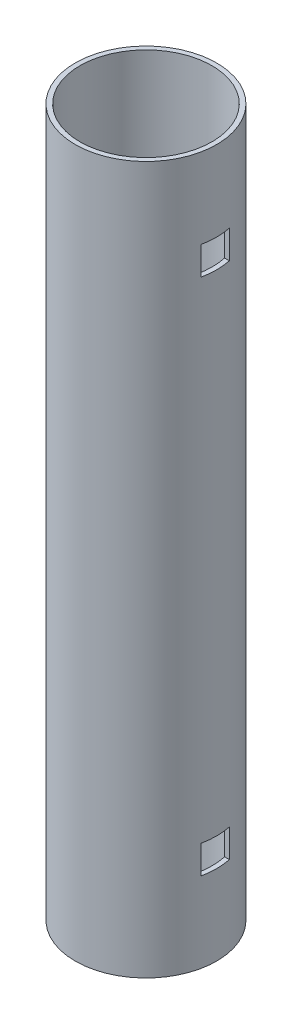
ISO-10303-21;
HEADER;
FILE_DESCRIPTION(('STEP AP214'),'2;1');
FILE_NAME('part.step','',(''),(''),'','','');
FILE_SCHEMA(('AUTOMOTIVE_DESIGN { 1 0 10303 214 1 1 1 1 }'));
ENDSEC;
DATA;
#1=APPLICATION_CONTEXT('core data for automotive mechanical design processes');
#2=APPLICATION_PROTOCOL_DEFINITION('international standard','automotive_design',2000,#1);
#3=PRODUCT_CONTEXT('',#1,'mechanical');
#4=PRODUCT('Part','Part','',(#3));
#5=PRODUCT_RELATED_PRODUCT_CATEGORY('part','',(#4));
#6=PRODUCT_DEFINITION_FORMATION('','',#4);
#7=PRODUCT_DEFINITION_CONTEXT('part definition',#1,'design');
#8=PRODUCT_DEFINITION('design','',#6,#7);
#9=PRODUCT_DEFINITION_SHAPE('','',#8);
#10=(LENGTH_UNIT() NAMED_UNIT(*) SI_UNIT(.MILLI.,.METRE.));
#11=(NAMED_UNIT(*) PLANE_ANGLE_UNIT() SI_UNIT($,.RADIAN.));
#12=(NAMED_UNIT(*) SI_UNIT($,.STERADIAN.) SOLID_ANGLE_UNIT());
#13=UNCERTAINTY_MEASURE_WITH_UNIT(LENGTH_MEASURE(1.E-05),#10,'distance_accuracy_value','');
#14=(GEOMETRIC_REPRESENTATION_CONTEXT(3) GLOBAL_UNCERTAINTY_ASSIGNED_CONTEXT((#13)) GLOBAL_UNIT_ASSIGNED_CONTEXT((#10,
#11,#12)) REPRESENTATION_CONTEXT('',''));
#15=CARTESIAN_POINT('',(0.,0.,0.));
#16=DIRECTION('',(0.,0.,1.));
#17=DIRECTION('',(1.,0.,0.));
#18=AXIS2_PLACEMENT_3D('',#15,#16,#17);
#19=CARTESIAN_POINT('',(0.,150.,0.));
#20=DIRECTION('',(0.,1.,0.));
#21=DIRECTION('',(0.,0.,1.));
#22=AXIS2_PLACEMENT_3D('',#19,#20,#21);
#23=PLANE('',#22);
#24=CARTESIAN_POINT('',(0.,150.,0.));
#25=DIRECTION('',(0.,1.,0.));
#26=DIRECTION('',(0.,0.,1.));
#27=AXIS2_PLACEMENT_3D('',#24,#25,#26);
#28=CIRCLE('',#27,15.);
#29=CARTESIAN_POINT('',(0.,150.,15.));
#30=VERTEX_POINT('',#29);
#31=EDGE_CURVE('E203',#30,#30,#28,.T.);
#32=ORIENTED_EDGE('',*,*,#31,.T.);
#33=EDGE_LOOP('',(#32));
#34=FACE_BOUND('',#33,.T.);
#35=CARTESIAN_POINT('',(0.,150.,0.));
#36=DIRECTION('',(0.,1.,0.));
#37=DIRECTION('',(0.,0.,1.));
#38=AXIS2_PLACEMENT_3D('',#35,#36,#37);
#39=CIRCLE('',#38,14.);
#40=CARTESIAN_POINT('',(0.,150.,14.));
#41=VERTEX_POINT('',#40);
#42=EDGE_CURVE('E197',#41,#41,#39,.T.);
#43=ORIENTED_EDGE('',*,*,#42,.F.);
#44=EDGE_LOOP('',(#43));
#45=FACE_BOUND('',#44,.T.);
#46=ADVANCED_FACE('F35',(#34,#45),#23,.T.);
#47=CARTESIAN_POINT('',(0.,0.,0.));
#48=DIRECTION('',(0.,1.,0.));
#49=DIRECTION('',(0.,0.,1.));
#50=AXIS2_PLACEMENT_3D('',#47,#48,#49);
#51=PLANE('',#50);
#52=CARTESIAN_POINT('',(0.,0.,0.));
#53=DIRECTION('',(0.,1.,0.));
#54=DIRECTION('',(0.,0.,1.));
#55=AXIS2_PLACEMENT_3D('',#52,#53,#54);
#56=CIRCLE('',#55,15.);
#57=CARTESIAN_POINT('',(0.,0.,15.));
#58=VERTEX_POINT('',#57);
#59=EDGE_CURVE('E200',#58,#58,#56,.T.);
#60=ORIENTED_EDGE('',*,*,#59,.F.);
#61=EDGE_LOOP('',(#60));
#62=FACE_BOUND('',#61,.T.);
#63=CARTESIAN_POINT('',(0.,0.,0.));
#64=DIRECTION('',(0.,1.,0.));
#65=DIRECTION('',(0.,0.,1.));
#66=AXIS2_PLACEMENT_3D('',#63,#64,#65);
#67=CIRCLE('',#66,14.);
#68=CARTESIAN_POINT('',(0.,0.,14.));
#69=VERTEX_POINT('',#68);
#70=EDGE_CURVE('E196',#69,#69,#67,.T.);
#71=ORIENTED_EDGE('',*,*,#70,.T.);
#72=EDGE_LOOP('',(#71));
#73=FACE_BOUND('',#72,.T.);
#74=ADVANCED_FACE('F300',(#62,#73),#51,.F.);
#75=CARTESIAN_POINT('',(0.,150.,0.));
#76=DIRECTION('',(0.,-1.,0.));
#77=DIRECTION('',(0.,0.,-1.));
#78=AXIS2_PLACEMENT_3D('',#75,#76,#77);
#79=CYLINDRICAL_SURFACE('',#78,15.);
#80=DIRECTION('',(0.,-1.,0.));
#81=VECTOR('',#80,1.);
#82=CARTESIAN_POINT('',(-14.6969384566991,150.,-3.));
#83=LINE('',#82,#81);
#84=CARTESIAN_POINT('',(-14.6969384566991,17.,-3.));
#85=VERTEX_POINT('',#84);
#86=CARTESIAN_POINT('',(-14.6969384566991,23.,-3.));
#87=VERTEX_POINT('',#86);
#88=EDGE_CURVE('E192',#85,#87,#83,.F.);
#89=ORIENTED_EDGE('',*,*,#88,.T.);
#90=CARTESIAN_POINT('',(0.,23.,0.));
#91=DIRECTION('',(0.,1.,0.));
#92=DIRECTION('',(0.,0.,1.));
#93=AXIS2_PLACEMENT_3D('',#90,#91,#92);
#94=CIRCLE('',#93,15.);
#95=CARTESIAN_POINT('',(-14.6969384566991,23.,3.));
#96=VERTEX_POINT('',#95);
#97=EDGE_CURVE('E50',#87,#96,#94,.T.);
#98=ORIENTED_EDGE('',*,*,#97,.T.);
#99=DIRECTION('',(0.,-1.,0.));
#100=VECTOR('',#99,1.);
#101=CARTESIAN_POINT('',(-14.6969384566991,150.,3.));
#102=LINE('',#101,#100);
#103=CARTESIAN_POINT('',(-14.6969384566991,17.,3.));
#104=VERTEX_POINT('',#103);
#105=EDGE_CURVE('E187',#96,#104,#102,.T.);
#106=ORIENTED_EDGE('',*,*,#105,.T.);
#107=CARTESIAN_POINT('',(0.,17.,0.));
#108=DIRECTION('',(0.,-1.,0.));
#109=DIRECTION('',(0.,0.,-1.));
#110=AXIS2_PLACEMENT_3D('',#107,#108,#109);
#111=CIRCLE('',#110,15.);
#112=EDGE_CURVE('E189',#104,#85,#111,.T.);
#113=ORIENTED_EDGE('',*,*,#112,.T.);
#114=EDGE_LOOP('',(#89,#98,#106,#113));
#115=FACE_BOUND('',#114,.T.);
#116=DIRECTION('',(0.,-1.,0.));
#117=VECTOR('',#116,1.);
#118=CARTESIAN_POINT('',(14.6969384566991,150.,3.));
#119=LINE('',#118,#117);
#120=CARTESIAN_POINT('',(14.6969384566991,17.,3.));
#121=VERTEX_POINT('',#120);
#122=CARTESIAN_POINT('',(14.6969384566991,23.,3.));
#123=VERTEX_POINT('',#122);
#124=EDGE_CURVE('E185',#121,#123,#119,.F.);
#125=ORIENTED_EDGE('',*,*,#124,.T.);
#126=CARTESIAN_POINT('',(14.6969384566991,23.,-3.));
#127=VERTEX_POINT('',#126);
#128=EDGE_CURVE('E58',#123,#127,#94,.T.);
#129=ORIENTED_EDGE('',*,*,#128,.T.);
#130=DIRECTION('',(0.,-1.,0.));
#131=VECTOR('',#130,1.);
#132=CARTESIAN_POINT('',(14.6969384566991,150.,-3.));
#133=LINE('',#132,#131);
#134=CARTESIAN_POINT('',(14.6969384566991,17.,-3.));
#135=VERTEX_POINT('',#134);
#136=EDGE_CURVE('E194',#127,#135,#133,.T.);
#137=ORIENTED_EDGE('',*,*,#136,.T.);
#138=EDGE_CURVE('E190',#135,#121,#111,.T.);
#139=ORIENTED_EDGE('',*,*,#138,.T.);
#140=EDGE_LOOP('',(#125,#129,#137,#139));
#141=FACE_BOUND('',#140,.T.);
#142=DIRECTION('',(0.,-1.,0.));
#143=VECTOR('',#142,1.);
#144=CARTESIAN_POINT('',(-14.6969384566991,150.,-3.));
#145=LINE('',#144,#143);
#146=CARTESIAN_POINT('',(-14.6969384566991,127.,-3.));
#147=VERTEX_POINT('',#146);
#148=CARTESIAN_POINT('',(-14.6969384566991,133.,-3.));
#149=VERTEX_POINT('',#148);
#150=EDGE_CURVE('E166',#147,#149,#145,.F.);
#151=ORIENTED_EDGE('',*,*,#150,.T.);
#152=CARTESIAN_POINT('',(0.,133.,0.));
#153=DIRECTION('',(0.,1.,0.));
#154=DIRECTION('',(0.,0.,1.));
#155=AXIS2_PLACEMENT_3D('',#152,#153,#154);
#156=CIRCLE('',#155,15.);
#157=CARTESIAN_POINT('',(-14.6969384566991,133.,3.));
#158=VERTEX_POINT('',#157);
#159=EDGE_CURVE('E148',#149,#158,#156,.T.);
#160=ORIENTED_EDGE('',*,*,#159,.T.);
#161=DIRECTION('',(0.,-1.,0.));
#162=VECTOR('',#161,1.);
#163=CARTESIAN_POINT('',(-14.6969384566991,150.,3.));
#164=LINE('',#163,#162);
#165=CARTESIAN_POINT('',(-14.6969384566991,127.,3.));
#166=VERTEX_POINT('',#165);
#167=EDGE_CURVE('E283',#158,#166,#164,.T.);
#168=ORIENTED_EDGE('',*,*,#167,.T.);
#169=CARTESIAN_POINT('',(0.,127.,0.));
#170=DIRECTION('',(0.,-1.,0.));
#171=DIRECTION('',(0.,0.,-1.));
#172=AXIS2_PLACEMENT_3D('',#169,#170,#171);
#173=CIRCLE('',#172,15.);
#174=EDGE_CURVE('E175',#166,#147,#173,.T.);
#175=ORIENTED_EDGE('',*,*,#174,.T.);
#176=EDGE_LOOP('',(#151,#160,#168,#175));
#177=FACE_BOUND('',#176,.T.);
#178=DIRECTION('',(0.,-1.,0.));
#179=VECTOR('',#178,1.);
#180=CARTESIAN_POINT('',(14.6969384566991,150.,3.));
#181=LINE('',#180,#179);
#182=CARTESIAN_POINT('',(14.6969384566991,127.,3.));
#183=VERTEX_POINT('',#182);
#184=CARTESIAN_POINT('',(14.6969384566991,133.,3.));
#185=VERTEX_POINT('',#184);
#186=EDGE_CURVE('E281',#183,#185,#181,.F.);
#187=ORIENTED_EDGE('',*,*,#186,.T.);
#188=CARTESIAN_POINT('',(14.6969384566991,133.,-3.));
#189=VERTEX_POINT('',#188);
#190=EDGE_CURVE('E159',#185,#189,#156,.T.);
#191=ORIENTED_EDGE('',*,*,#190,.T.);
#192=DIRECTION('',(0.,-1.,0.));
#193=VECTOR('',#192,1.);
#194=CARTESIAN_POINT('',(14.6969384566991,150.,-3.));
#195=LINE('',#194,#193);
#196=CARTESIAN_POINT('',(14.6969384566991,127.,-3.));
#197=VERTEX_POINT('',#196);
#198=EDGE_CURVE('E176',#189,#197,#195,.T.);
#199=ORIENTED_EDGE('',*,*,#198,.T.);
#200=EDGE_CURVE('E177',#197,#183,#173,.T.);
#201=ORIENTED_EDGE('',*,*,#200,.T.);
#202=EDGE_LOOP('',(#187,#191,#199,#201));
#203=FACE_BOUND('',#202,.T.);
#204=ORIENTED_EDGE('',*,*,#31,.F.);
#205=EDGE_LOOP('',(#204));
#206=FACE_BOUND('',#205,.T.);
#207=ORIENTED_EDGE('',*,*,#59,.T.);
#208=EDGE_LOOP('',(#207));
#209=FACE_BOUND('',#208,.T.);
#210=ADVANCED_FACE('F37',(#115,#141,#177,#203,#206,#209),#79,.T.);
#211=CARTESIAN_POINT('',(0.,150.,0.));
#212=DIRECTION('',(0.,-1.,0.));
#213=DIRECTION('',(0.,0.,-1.));
#214=AXIS2_PLACEMENT_3D('',#211,#212,#213);
#215=CYLINDRICAL_SURFACE('',#214,14.);
#216=DIRECTION('',(0.,-1.,0.));
#217=VECTOR('',#216,1.);
#218=CARTESIAN_POINT('',(13.6747943311773,150.,-3.));
#219=LINE('',#218,#217);
#220=CARTESIAN_POINT('',(13.6747943311773,23.,-3.));
#221=VERTEX_POINT('',#220);
#222=CARTESIAN_POINT('',(13.6747943311773,17.,-3.));
#223=VERTEX_POINT('',#222);
#224=EDGE_CURVE('E11',#221,#223,#219,.T.);
#225=ORIENTED_EDGE('',*,*,#224,.F.);
#226=CARTESIAN_POINT('',(0.,23.,0.));
#227=DIRECTION('',(0.,1.,0.));
#228=DIRECTION('',(0.,0.,1.));
#229=AXIS2_PLACEMENT_3D('',#226,#227,#228);
#230=CIRCLE('',#229,14.);
#231=CARTESIAN_POINT('',(13.6747943311773,23.,3.));
#232=VERTEX_POINT('',#231);
#233=EDGE_CURVE('E225',#232,#221,#230,.T.);
#234=ORIENTED_EDGE('',*,*,#233,.F.);
#235=DIRECTION('',(0.,-1.,0.));
#236=VECTOR('',#235,1.);
#237=CARTESIAN_POINT('',(13.6747943311773,150.,3.));
#238=LINE('',#237,#236);
#239=CARTESIAN_POINT('',(13.6747943311773,17.,3.));
#240=VERTEX_POINT('',#239);
#241=EDGE_CURVE('E231',#240,#232,#238,.F.);
#242=ORIENTED_EDGE('',*,*,#241,.F.);
#243=CARTESIAN_POINT('',(0.,17.,0.));
#244=DIRECTION('',(0.,-1.,0.));
#245=DIRECTION('',(0.,0.,-1.));
#246=AXIS2_PLACEMENT_3D('',#243,#244,#245);
#247=CIRCLE('',#246,14.);
#248=EDGE_CURVE('E43',#223,#240,#247,.T.);
#249=ORIENTED_EDGE('',*,*,#248,.F.);
#250=EDGE_LOOP('',(#225,#234,#242,#249));
#251=FACE_BOUND('',#250,.T.);
#252=DIRECTION('',(0.,-1.,0.));
#253=VECTOR('',#252,1.);
#254=CARTESIAN_POINT('',(-13.6747943311773,150.,-3.));
#255=LINE('',#254,#253);
#256=CARTESIAN_POINT('',(-13.6747943311773,17.,-3.));
#257=VERTEX_POINT('',#256);
#258=CARTESIAN_POINT('',(-13.6747943311773,23.,-3.));
#259=VERTEX_POINT('',#258);
#260=EDGE_CURVE('E229',#257,#259,#255,.F.);
#261=ORIENTED_EDGE('',*,*,#260,.F.);
#262=CARTESIAN_POINT('',(-13.6747943311773,17.,3.));
#263=VERTEX_POINT('',#262);
#264=EDGE_CURVE('E227',#263,#257,#247,.T.);
#265=ORIENTED_EDGE('',*,*,#264,.F.);
#266=DIRECTION('',(0.,-1.,0.));
#267=VECTOR('',#266,1.);
#268=CARTESIAN_POINT('',(-13.6747943311773,150.,3.));
#269=LINE('',#268,#267);
#270=CARTESIAN_POINT('',(-13.6747943311773,23.,3.));
#271=VERTEX_POINT('',#270);
#272=EDGE_CURVE('E224',#271,#263,#269,.T.);
#273=ORIENTED_EDGE('',*,*,#272,.F.);
#274=EDGE_CURVE('E222',#259,#271,#230,.T.);
#275=ORIENTED_EDGE('',*,*,#274,.F.);
#276=EDGE_LOOP('',(#261,#265,#273,#275));
#277=FACE_BOUND('',#276,.T.);
#278=DIRECTION('',(0.,-1.,0.));
#279=VECTOR('',#278,1.);
#280=CARTESIAN_POINT('',(13.6747943311773,150.,-3.));
#281=LINE('',#280,#279);
#282=CARTESIAN_POINT('',(13.6747943311773,133.,-3.));
#283=VERTEX_POINT('',#282);
#284=CARTESIAN_POINT('',(13.6747943311773,127.,-3.));
#285=VERTEX_POINT('',#284);
#286=EDGE_CURVE('E220',#283,#285,#281,.T.);
#287=ORIENTED_EDGE('',*,*,#286,.F.);
#288=CARTESIAN_POINT('',(0.,133.,0.));
#289=DIRECTION('',(0.,1.,0.));
#290=DIRECTION('',(0.,0.,1.));
#291=AXIS2_PLACEMENT_3D('',#288,#289,#290);
#292=CIRCLE('',#291,14.);
#293=CARTESIAN_POINT('',(13.6747943311773,133.,3.));
#294=VERTEX_POINT('',#293);
#295=EDGE_CURVE('E211',#294,#283,#292,.T.);
#296=ORIENTED_EDGE('',*,*,#295,.F.);
#297=DIRECTION('',(0.,-1.,0.));
#298=VECTOR('',#297,1.);
#299=CARTESIAN_POINT('',(13.6747943311773,150.,3.));
#300=LINE('',#299,#298);
#301=CARTESIAN_POINT('',(13.6747943311773,127.,3.));
#302=VERTEX_POINT('',#301);
#303=EDGE_CURVE('E217',#302,#294,#300,.F.);
#304=ORIENTED_EDGE('',*,*,#303,.F.);
#305=CARTESIAN_POINT('',(0.,127.,0.));
#306=DIRECTION('',(0.,-1.,0.));
#307=DIRECTION('',(0.,0.,-1.));
#308=AXIS2_PLACEMENT_3D('',#305,#306,#307);
#309=CIRCLE('',#308,14.);
#310=EDGE_CURVE('E215',#285,#302,#309,.T.);
#311=ORIENTED_EDGE('',*,*,#310,.F.);
#312=EDGE_LOOP('',(#287,#296,#304,#311));
#313=FACE_BOUND('',#312,.T.);
#314=DIRECTION('',(0.,-1.,0.));
#315=VECTOR('',#314,1.);
#316=CARTESIAN_POINT('',(-13.6747943311773,150.,-3.));
#317=LINE('',#316,#315);
#318=CARTESIAN_POINT('',(-13.6747943311773,127.,-3.));
#319=VERTEX_POINT('',#318);
#320=CARTESIAN_POINT('',(-13.6747943311773,133.,-3.));
#321=VERTEX_POINT('',#320);
#322=EDGE_CURVE('E169',#319,#321,#317,.F.);
#323=ORIENTED_EDGE('',*,*,#322,.F.);
#324=CARTESIAN_POINT('',(-13.6747943311773,127.,3.));
#325=VERTEX_POINT('',#324);
#326=EDGE_CURVE('E213',#325,#319,#309,.T.);
#327=ORIENTED_EDGE('',*,*,#326,.F.);
#328=DIRECTION('',(0.,-1.,0.));
#329=VECTOR('',#328,1.);
#330=CARTESIAN_POINT('',(-13.6747943311773,150.,3.));
#331=LINE('',#330,#329);
#332=CARTESIAN_POINT('',(-13.6747943311773,133.,3.));
#333=VERTEX_POINT('',#332);
#334=EDGE_CURVE('E210',#333,#325,#331,.T.);
#335=ORIENTED_EDGE('',*,*,#334,.F.);
#336=EDGE_CURVE('E206',#321,#333,#292,.T.);
#337=ORIENTED_EDGE('',*,*,#336,.F.);
#338=EDGE_LOOP('',(#323,#327,#335,#337));
#339=FACE_BOUND('',#338,.T.);
#340=ORIENTED_EDGE('',*,*,#42,.T.);
#341=EDGE_LOOP('',(#340));
#342=FACE_BOUND('',#341,.T.);
#343=ORIENTED_EDGE('',*,*,#70,.F.);
#344=EDGE_LOOP('',(#343));
#345=FACE_BOUND('',#344,.T.);
#346=ADVANCED_FACE('F254',(#251,#277,#313,#339,#342,#345),#215,.F.);
#347=CARTESIAN_POINT('',(-15.,133.,3.));
#348=DIRECTION('',(0.,1.,0.));
#349=DIRECTION('',(0.,0.,1.));
#350=AXIS2_PLACEMENT_3D('',#347,#348,#349);
#351=PLANE('',#350);
#352=DIRECTION('',(1.,0.,0.));
#353=VECTOR('',#352,1.);
#354=CARTESIAN_POINT('',(-15.,133.,-3.));
#355=LINE('',#354,#353);
#356=EDGE_CURVE('E151',#149,#321,#355,.T.);
#357=ORIENTED_EDGE('',*,*,#356,.T.);
#358=ORIENTED_EDGE('',*,*,#336,.T.);
#359=DIRECTION('',(1.,0.,0.));
#360=VECTOR('',#359,1.);
#361=CARTESIAN_POINT('',(-15.,133.,3.));
#362=LINE('',#361,#360);
#363=EDGE_CURVE('E154',#158,#333,#362,.T.);
#364=ORIENTED_EDGE('',*,*,#363,.F.);
#365=ORIENTED_EDGE('',*,*,#159,.F.);
#366=EDGE_LOOP('',(#357,#358,#364,#365));
#367=FACE_BOUND('',#366,.T.);
#368=ADVANCED_FACE('F150',(#367),#351,.F.);
#369=CARTESIAN_POINT('',(-15.,133.,3.));
#370=DIRECTION('',(0.,0.,1.));
#371=DIRECTION('',(1.,0.,0.));
#372=AXIS2_PLACEMENT_3D('',#369,#370,#371);
#373=PLANE('',#372);
#374=ORIENTED_EDGE('',*,*,#363,.T.);
#375=ORIENTED_EDGE('',*,*,#334,.T.);
#376=DIRECTION('',(1.,0.,0.));
#377=VECTOR('',#376,1.);
#378=CARTESIAN_POINT('',(-15.,127.,3.));
#379=LINE('',#378,#377);
#380=EDGE_CURVE('E274',#166,#325,#379,.T.);
#381=ORIENTED_EDGE('',*,*,#380,.F.);
#382=ORIENTED_EDGE('',*,*,#167,.F.);
#383=EDGE_LOOP('',(#374,#375,#381,#382));
#384=FACE_BOUND('',#383,.T.);
#385=ADVANCED_FACE('F286',(#384),#373,.F.);
#386=CARTESIAN_POINT('',(-15.,127.,3.));
#387=DIRECTION('',(0.,-1.,0.));
#388=DIRECTION('',(0.,0.,-1.));
#389=AXIS2_PLACEMENT_3D('',#386,#387,#388);
#390=PLANE('',#389);
#391=ORIENTED_EDGE('',*,*,#380,.T.);
#392=ORIENTED_EDGE('',*,*,#326,.T.);
#393=DIRECTION('',(1.,0.,0.));
#394=VECTOR('',#393,1.);
#395=CARTESIAN_POINT('',(-15.,127.,-3.));
#396=LINE('',#395,#394);
#397=EDGE_CURVE('E251',#147,#319,#396,.T.);
#398=ORIENTED_EDGE('',*,*,#397,.F.);
#399=ORIENTED_EDGE('',*,*,#174,.F.);
#400=EDGE_LOOP('',(#391,#392,#398,#399));
#401=FACE_BOUND('',#400,.T.);
#402=ADVANCED_FACE('F291',(#401),#390,.F.);
#403=CARTESIAN_POINT('',(-15.,133.,-3.));
#404=DIRECTION('',(0.,0.,-1.));
#405=DIRECTION('',(-1.,0.,0.));
#406=AXIS2_PLACEMENT_3D('',#403,#404,#405);
#407=PLANE('',#406);
#408=ORIENTED_EDGE('',*,*,#397,.T.);
#409=ORIENTED_EDGE('',*,*,#322,.T.);
#410=ORIENTED_EDGE('',*,*,#356,.F.);
#411=ORIENTED_EDGE('',*,*,#150,.F.);
#412=EDGE_LOOP('',(#408,#409,#410,#411));
#413=FACE_BOUND('',#412,.T.);
#414=ADVANCED_FACE('F165',(#413),#407,.F.);
#415=EDGE_CURVE('E172',#283,#189,#355,.T.);
#416=ORIENTED_EDGE('',*,*,#415,.F.);
#417=ORIENTED_EDGE('',*,*,#286,.T.);
#418=EDGE_CURVE('E271',#285,#197,#396,.T.);
#419=ORIENTED_EDGE('',*,*,#418,.T.);
#420=ORIENTED_EDGE('',*,*,#198,.F.);
#421=EDGE_LOOP('',(#416,#417,#419,#420));
#422=FACE_BOUND('',#421,.T.);
#423=ADVANCED_FACE('F311',(#422),#407,.F.);
#424=ORIENTED_EDGE('',*,*,#418,.F.);
#425=ORIENTED_EDGE('',*,*,#310,.T.);
#426=EDGE_CURVE('E275',#302,#183,#379,.T.);
#427=ORIENTED_EDGE('',*,*,#426,.T.);
#428=ORIENTED_EDGE('',*,*,#200,.F.);
#429=EDGE_LOOP('',(#424,#425,#427,#428));
#430=FACE_BOUND('',#429,.T.);
#431=ADVANCED_FACE('F314',(#430),#390,.F.);
#432=ORIENTED_EDGE('',*,*,#426,.F.);
#433=ORIENTED_EDGE('',*,*,#303,.T.);
#434=EDGE_CURVE('E171',#294,#185,#362,.T.);
#435=ORIENTED_EDGE('',*,*,#434,.T.);
#436=ORIENTED_EDGE('',*,*,#186,.F.);
#437=EDGE_LOOP('',(#432,#433,#435,#436));
#438=FACE_BOUND('',#437,.T.);
#439=ADVANCED_FACE('F320',(#438),#373,.F.);
#440=ORIENTED_EDGE('',*,*,#434,.F.);
#441=ORIENTED_EDGE('',*,*,#295,.T.);
#442=ORIENTED_EDGE('',*,*,#415,.T.);
#443=ORIENTED_EDGE('',*,*,#190,.F.);
#444=EDGE_LOOP('',(#440,#441,#442,#443));
#445=FACE_BOUND('',#444,.T.);
#446=ADVANCED_FACE('F316',(#445),#351,.F.);
#447=CARTESIAN_POINT('',(-15.,23.,3.));
#448=DIRECTION('',(0.,1.,0.));
#449=DIRECTION('',(0.,0.,1.));
#450=AXIS2_PLACEMENT_3D('',#447,#448,#449);
#451=PLANE('',#450);
#452=DIRECTION('',(1.,0.,0.));
#453=VECTOR('',#452,1.);
#454=CARTESIAN_POINT('',(-15.,23.,-3.));
#455=LINE('',#454,#453);
#456=EDGE_CURVE('E250',#87,#259,#455,.T.);
#457=ORIENTED_EDGE('',*,*,#456,.T.);
#458=ORIENTED_EDGE('',*,*,#274,.T.);
#459=DIRECTION('',(1.,0.,0.));
#460=VECTOR('',#459,1.);
#461=CARTESIAN_POINT('',(-15.,23.,3.));
#462=LINE('',#461,#460);
#463=EDGE_CURVE('E264',#96,#271,#462,.T.);
#464=ORIENTED_EDGE('',*,*,#463,.F.);
#465=ORIENTED_EDGE('',*,*,#97,.F.);
#466=EDGE_LOOP('',(#457,#458,#464,#465));
#467=FACE_BOUND('',#466,.T.);
#468=ADVANCED_FACE('F319',(#467),#451,.F.);
#469=CARTESIAN_POINT('',(-15.,23.,3.));
#470=DIRECTION('',(0.,0.,1.));
#471=DIRECTION('',(1.,0.,0.));
#472=AXIS2_PLACEMENT_3D('',#469,#470,#471);
#473=PLANE('',#472);
#474=ORIENTED_EDGE('',*,*,#463,.T.);
#475=ORIENTED_EDGE('',*,*,#272,.T.);
#476=DIRECTION('',(1.,0.,0.));
#477=VECTOR('',#476,1.);
#478=CARTESIAN_POINT('',(-15.,17.,3.));
#479=LINE('',#478,#477);
#480=EDGE_CURVE('E263',#104,#263,#479,.T.);
#481=ORIENTED_EDGE('',*,*,#480,.F.);
#482=ORIENTED_EDGE('',*,*,#105,.F.);
#483=EDGE_LOOP('',(#474,#475,#481,#482));
#484=FACE_BOUND('',#483,.T.);
#485=ADVANCED_FACE('F332',(#484),#473,.F.);
#486=CARTESIAN_POINT('',(-15.,17.,3.));
#487=DIRECTION('',(0.,-1.,0.));
#488=DIRECTION('',(0.,0.,-1.));
#489=AXIS2_PLACEMENT_3D('',#486,#487,#488);
#490=PLANE('',#489);
#491=ORIENTED_EDGE('',*,*,#480,.T.);
#492=ORIENTED_EDGE('',*,*,#264,.T.);
#493=DIRECTION('',(1.,0.,0.));
#494=VECTOR('',#493,1.);
#495=CARTESIAN_POINT('',(-15.,17.,-3.));
#496=LINE('',#495,#494);
#497=EDGE_CURVE('E160',#85,#257,#496,.T.);
#498=ORIENTED_EDGE('',*,*,#497,.F.);
#499=ORIENTED_EDGE('',*,*,#112,.F.);
#500=EDGE_LOOP('',(#491,#492,#498,#499));
#501=FACE_BOUND('',#500,.T.);
#502=ADVANCED_FACE('F335',(#501),#490,.F.);
#503=CARTESIAN_POINT('',(-15.,23.,-3.));
#504=DIRECTION('',(0.,0.,-1.));
#505=DIRECTION('',(-1.,0.,0.));
#506=AXIS2_PLACEMENT_3D('',#503,#504,#505);
#507=PLANE('',#506);
#508=ORIENTED_EDGE('',*,*,#497,.T.);
#509=ORIENTED_EDGE('',*,*,#260,.T.);
#510=ORIENTED_EDGE('',*,*,#456,.F.);
#511=ORIENTED_EDGE('',*,*,#88,.F.);
#512=EDGE_LOOP('',(#508,#509,#510,#511));
#513=FACE_BOUND('',#512,.T.);
#514=ADVANCED_FACE('F329',(#513),#507,.F.);
#515=EDGE_CURVE('E241',#221,#127,#455,.T.);
#516=ORIENTED_EDGE('',*,*,#515,.F.);
#517=ORIENTED_EDGE('',*,*,#224,.T.);
#518=EDGE_CURVE('E260',#223,#135,#496,.T.);
#519=ORIENTED_EDGE('',*,*,#518,.T.);
#520=ORIENTED_EDGE('',*,*,#136,.F.);
#521=EDGE_LOOP('',(#516,#517,#519,#520));
#522=FACE_BOUND('',#521,.T.);
#523=ADVANCED_FACE('F247',(#522),#507,.F.);
#524=ORIENTED_EDGE('',*,*,#518,.F.);
#525=ORIENTED_EDGE('',*,*,#248,.T.);
#526=EDGE_CURVE('E259',#240,#121,#479,.T.);
#527=ORIENTED_EDGE('',*,*,#526,.T.);
#528=ORIENTED_EDGE('',*,*,#138,.F.);
#529=EDGE_LOOP('',(#524,#525,#527,#528));
#530=FACE_BOUND('',#529,.T.);
#531=ADVANCED_FACE('F258',(#530),#490,.F.);
#532=ORIENTED_EDGE('',*,*,#526,.F.);
#533=ORIENTED_EDGE('',*,*,#241,.T.);
#534=EDGE_CURVE('E243',#232,#123,#462,.T.);
#535=ORIENTED_EDGE('',*,*,#534,.T.);
#536=ORIENTED_EDGE('',*,*,#124,.F.);
#537=EDGE_LOOP('',(#532,#533,#535,#536));
#538=FACE_BOUND('',#537,.T.);
#539=ADVANCED_FACE('F262',(#538),#473,.F.);
#540=ORIENTED_EDGE('',*,*,#534,.F.);
#541=ORIENTED_EDGE('',*,*,#233,.T.);
#542=ORIENTED_EDGE('',*,*,#515,.T.);
#543=ORIENTED_EDGE('',*,*,#128,.F.);
#544=EDGE_LOOP('',(#540,#541,#542,#543));
#545=FACE_BOUND('',#544,.T.);
#546=ADVANCED_FACE('F240',(#545),#451,.F.);
#547=CLOSED_SHELL('',(#46,#74,#210,#346,#368,#385,#402,#414,#423,#431,#439,#446,#468,#485,#502,
#514,#523,#531,#539,#546));
#548=MANIFOLD_SOLID_BREP('B2',#547);
#549=ADVANCED_BREP_SHAPE_REPRESENTATION('',(#18,#548),#14);
#550=SHAPE_DEFINITION_REPRESENTATION(#9,#549);
ENDSEC;
END-ISO-10303-21;
